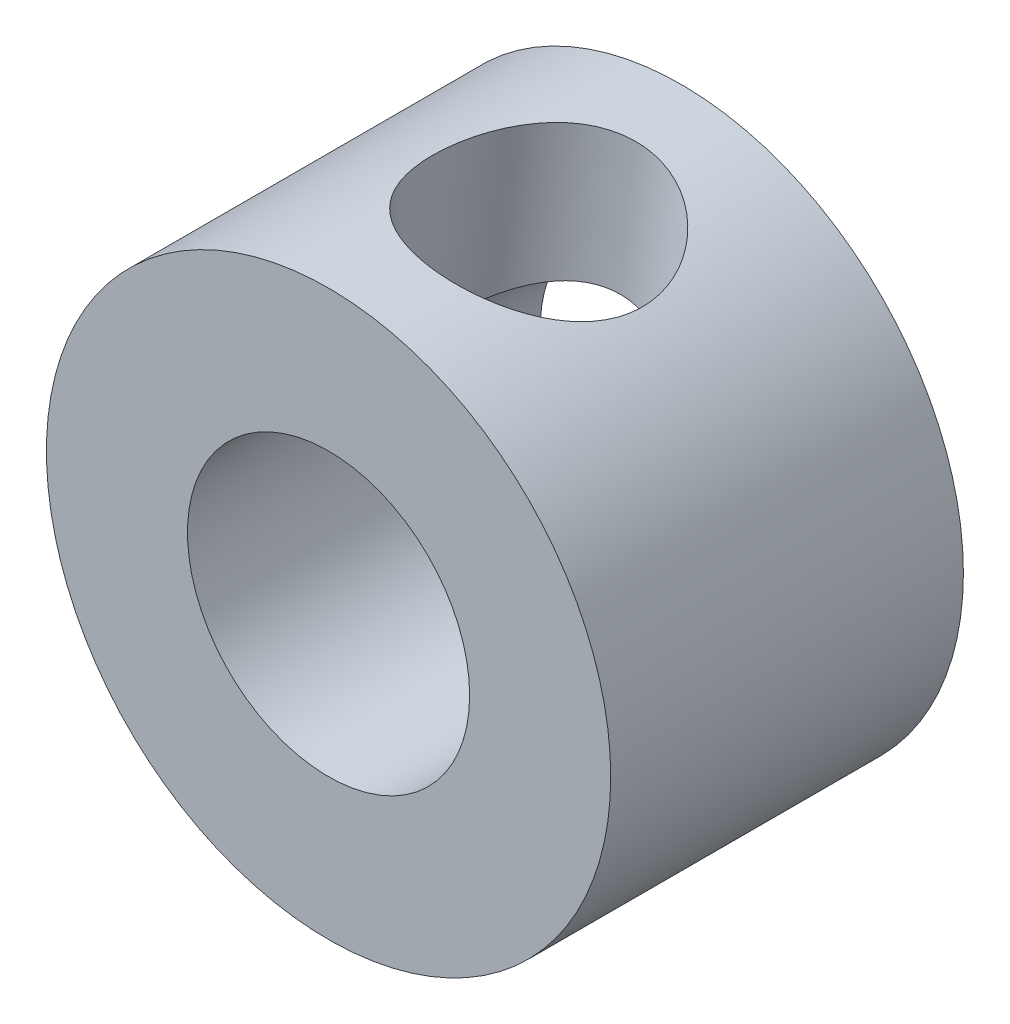
ISO-10303-21;
HEADER;
FILE_DESCRIPTION(('STEP AP214'),'2;1');
FILE_NAME('part.step','',(''),(''),'','','');
FILE_SCHEMA(('AUTOMOTIVE_DESIGN { 1 0 10303 214 1 1 1 1 }'));
ENDSEC;
DATA;
#1=APPLICATION_CONTEXT('core data for automotive mechanical design processes');
#2=APPLICATION_PROTOCOL_DEFINITION('international standard','automotive_design',2000,#1);
#3=PRODUCT_CONTEXT('',#1,'mechanical');
#4=PRODUCT('Part','Part','',(#3));
#5=PRODUCT_RELATED_PRODUCT_CATEGORY('part','',(#4));
#6=PRODUCT_DEFINITION_FORMATION('','',#4);
#7=PRODUCT_DEFINITION_CONTEXT('part definition',#1,'design');
#8=PRODUCT_DEFINITION('design','',#6,#7);
#9=PRODUCT_DEFINITION_SHAPE('','',#8);
#10=(LENGTH_UNIT() NAMED_UNIT(*) SI_UNIT(.MILLI.,.METRE.));
#11=(NAMED_UNIT(*) PLANE_ANGLE_UNIT() SI_UNIT($,.RADIAN.));
#12=(NAMED_UNIT(*) SI_UNIT($,.STERADIAN.) SOLID_ANGLE_UNIT());
#13=UNCERTAINTY_MEASURE_WITH_UNIT(LENGTH_MEASURE(1.E-05),#10,'distance_accuracy_value','');
#14=(GEOMETRIC_REPRESENTATION_CONTEXT(3) GLOBAL_UNCERTAINTY_ASSIGNED_CONTEXT((#13)) GLOBAL_UNIT_ASSIGNED_CONTEXT((#10,
#11,#12)) REPRESENTATION_CONTEXT('',''));
#15=CARTESIAN_POINT('',(0.,0.,0.));
#16=DIRECTION('',(0.,0.,1.));
#17=DIRECTION('',(1.,0.,0.));
#18=AXIS2_PLACEMENT_3D('',#15,#16,#17);
#19=CARTESIAN_POINT('',(0.,0.,5.));
#20=DIRECTION('',(0.,0.,-1.));
#21=DIRECTION('',(-1.,0.,0.));
#22=AXIS2_PLACEMENT_3D('',#19,#20,#21);
#23=CYLINDRICAL_SURFACE('',#22,4.);
#24=CARTESIAN_POINT('',(-1.02733928868957,3.86582125633284,2.5));
#25=CARTESIAN_POINT('',(-1.02734265890142,3.86581881922719,2.41899251627921));
#26=CARTESIAN_POINT('',(-1.02047273092971,3.8676652134899,2.33800507749636));
#27=CARTESIAN_POINT('',(-0.993330380940918,3.87472440822533,2.1784719170868));
#28=CARTESIAN_POINT('',(-0.973058360325385,3.87993710787487,2.09992612240499));
#29=CARTESIAN_POINT('',(-0.920043352540823,3.89284656011024,1.94762462838648));
#30=CARTESIAN_POINT('',(-0.887330247022073,3.90053735397063,1.87385794334892));
#31=CARTESIAN_POINT('',(-0.810587811596663,3.91720364104019,1.73262810318116));
#32=CARTESIAN_POINT('',(-0.766555082704462,3.92617951976729,1.66516684971748));
#33=CARTESIAN_POINT('',(-0.666225623724116,3.94447127927429,1.53510968837719));
#34=CARTESIAN_POINT('',(-0.609464559027656,3.95378419220841,1.47287147037061));
#35=CARTESIAN_POINT('',(-0.4864880266858,3.97079074456261,1.35827718532851));
#36=CARTESIAN_POINT('',(-0.420270547596204,3.97848403861505,1.30592322625815));
#37=CARTESIAN_POINT('',(-0.27765210171074,3.99101463726081,1.21086048770439));
#38=CARTESIAN_POINT('',(-0.20098128903239,3.99574585270344,1.16854052528415));
#39=CARTESIAN_POINT('',(-0.0414917882333371,4.00057872909077,1.09734882747509));
#40=CARTESIAN_POINT('',(0.041324756123118,4.00068199683108,1.06847242800803));
#41=CARTESIAN_POINT('',(0.206866213396435,3.99546799134705,1.02624210422539));
#42=CARTESIAN_POINT('',(0.289441002308203,3.99038433006285,1.01227237255955));
#43=CARTESIAN_POINT('',(0.455258661486501,3.97487915687381,0.998278799055018));
#44=CARTESIAN_POINT('',(0.538501305702838,3.96445938180064,0.998250422381297));
#45=CARTESIAN_POINT('',(0.698928723216405,3.93926018030917,1.01178176146518));
#46=CARTESIAN_POINT('',(0.776209453912666,3.92472194412767,1.02466929794882));
#47=CARTESIAN_POINT('',(0.926903635636088,3.89188894584785,1.06253591522556));
#48=CARTESIAN_POINT('',(1.00031681239976,3.87359391778997,1.08751585226205));
#49=CARTESIAN_POINT('',(1.14253869448108,3.83407574075199,1.14917045167585));
#50=CARTESIAN_POINT('',(1.2112648499092,3.81281385606815,1.18601000526841));
#51=CARTESIAN_POINT('',(1.34148554834756,3.76897125095874,1.27019209692939));
#52=CARTESIAN_POINT('',(1.40297774879397,3.74639010684228,1.31753802301761));
#53=CARTESIAN_POINT('',(1.52092399434128,3.70014008090216,1.42462728628319));
#54=CARTESIAN_POINT('',(1.57687273501997,3.67648486134498,1.48493391565043));
#55=CARTESIAN_POINT('',(1.67820536266551,3.63135110987348,1.61459299332157));
#56=CARTESIAN_POINT('',(1.72358659637367,3.60987312537567,1.68394770658664));
#57=CARTESIAN_POINT('',(1.80357654156705,3.57059492867679,1.83171946746283));
#58=CARTESIAN_POINT('',(1.83792378959015,3.55288692931804,1.91030349368607));
#59=CARTESIAN_POINT('',(1.89334712550917,3.52366713131311,2.07309622516758));
#60=CARTESIAN_POINT('',(1.91443059827223,3.5121518852494,2.15730177159369));
#61=CARTESIAN_POINT('',(1.94175867706646,3.49711375750742,2.32397596231596));
#62=CARTESIAN_POINT('',(1.94875781590315,3.49318496225103,2.40628410553614));
#63=CARTESIAN_POINT('',(1.94992934163625,3.49253178311701,2.57100935674174));
#64=CARTESIAN_POINT('',(1.94410493386362,3.49580559889858,2.65342643235247));
#65=CARTESIAN_POINT('',(1.92044816993536,3.50885218186317,2.81192992228768));
#66=CARTESIAN_POINT('',(1.90319894426611,3.51830907286495,2.88813113576466));
#67=CARTESIAN_POINT('',(1.85784220271283,3.54246776089607,3.03634794472019));
#68=CARTESIAN_POINT('',(1.82973246217915,3.55717063245602,3.10836267916813));
#69=CARTESIAN_POINT('',(1.76215624024822,3.59113945099152,3.2491644380762));
#70=CARTESIAN_POINT('',(1.72230355987914,3.61055578144953,3.31772929213734));
#71=CARTESIAN_POINT('',(1.63262589017459,3.65198154255814,3.44712898172604));
#72=CARTESIAN_POINT('',(1.58279725087144,3.67399192109369,3.50796097462463));
#73=CARTESIAN_POINT('',(1.47068350398614,3.72034836800946,3.62416837319509));
#74=CARTESIAN_POINT('',(1.40780898997722,3.74475405038438,3.67895340876875));
#75=CARTESIAN_POINT('',(1.27320802407256,3.79262929998244,3.77683836758943));
#76=CARTESIAN_POINT('',(1.20148154347427,3.81609886416987,3.81993825294583));
#77=CARTESIAN_POINT('',(1.05110686542589,3.86021832474947,3.89294605619961));
#78=CARTESIAN_POINT('',(0.97248348814519,3.88087770064718,3.9228991237926));
#79=CARTESIAN_POINT('',(0.810281854439043,3.91795219545285,3.96865641384991));
#80=CARTESIAN_POINT('',(0.726705946228717,3.93436930632356,3.98446728542239));
#81=CARTESIAN_POINT('',(0.562177933555114,3.96112324673068,4.00077440275482));
#82=CARTESIAN_POINT('',(0.48135678463265,3.97175867360409,4.00210948305898));
#83=CARTESIAN_POINT('',(0.320078244636425,3.98799646675953,3.9915848405546));
#84=CARTESIAN_POINT('',(0.2396208108665,3.99359943990992,3.97972670911414));
#85=CARTESIAN_POINT('',(0.0833974680032548,3.99987680656648,3.94374114850637));
#86=CARTESIAN_POINT('',(0.00756499017876403,4.0006681013615,3.91992009412164));
#87=CARTESIAN_POINT('',(-0.139502231962902,3.99824386008284,3.86098998661563));
#88=CARTESIAN_POINT('',(-0.210736102869378,3.99502756519122,3.82587879669524));
#89=CARTESIAN_POINT('',(-0.349765941492791,3.98531365243125,3.74368605649518));
#90=CARTESIAN_POINT('',(-0.417291518300253,3.97868378313563,3.69616335948585));
#91=CARTESIAN_POINT('',(-0.543877935032302,3.96336590741857,3.59119216981239));
#92=CARTESIAN_POINT('',(-0.602935739703128,3.95467716594465,3.53374013419212));
#93=CARTESIAN_POINT('',(-0.713971363937379,3.93618872238693,3.40693586835493));
#94=CARTESIAN_POINT('',(-0.765410997054105,3.9263545884823,3.33711559784568));
#95=CARTESIAN_POINT('',(-0.855649513374975,3.90768414164497,3.18958413042667));
#96=CARTESIAN_POINT('',(-0.894447085128546,3.89884793229615,3.11187211594651));
#97=CARTESIAN_POINT('',(-0.95928210885051,3.88341981008075,2.94704431902459));
#98=CARTESIAN_POINT('',(-0.984685589275191,3.87694327008552,2.85966563348821));
#99=CARTESIAN_POINT('',(-1.01870675451208,3.86814672928786,2.68151472804421));
#100=CARTESIAN_POINT('',(-1.02733551336977,3.86582398638472,2.59074478729001));
#101=CARTESIAN_POINT('',(-1.02733928868957,3.86582125633284,2.5));
#102=B_SPLINE_CURVE_WITH_KNOTS('',3,(#24,#25,#26,#27,#28,#29,#30,#31,#32,#33,#34,#35,#36,#37,
#38,#39,#40,#41,#42,#43,#44,#45,#46,#47,#48,#49,#50,#51,#52,#53,#54,#55,#56,#57,#58,#59,#60,#61,
#62,#63,#64,#65,#66,#67,#68,#69,#70,#71,#72,#73,#74,#75,#76,#77,#78,#79,#80,#81,#82,#83,#84,#85,
#86,#87,#88,#89,#90,#91,#92,#93,#94,#95,#96,#97,#98,#99,#100,#101),.UNSPECIFIED.,.T.,.F.,(4,2,2,
2,2,2,2,2,2,2,2,2,2,2,2,2,2,2,2,2,2,2,2,2,2,2,2,2,2,2,2,2,2,2,2,2,2,2,4),(0.,0.242684541416169,
0.485361814598853,0.727459856757027,0.96963067968293,1.22274652401127,1.47591628822982,
1.7377007213642,1.99939426381329,2.24980018489678,2.50012465404856,2.73806472803193,
2.97602165263334,3.21744131210667,3.45893893628974,3.71456675065873,3.97025867827333,
4.23162592252965,4.49284751635472,4.73965657740483,4.98640395388882,5.22143845928196,
5.45652113429524,5.70041561005819,5.94439948466353,6.20385016993621,6.46330169650175,
6.72185508890165,6.98028685560124,7.22365720549933,7.46699820319476,7.70440274003887,
7.94185223512827,8.18928323676983,8.4368027089496,8.69738599542075,8.95799630544238,
9.23003178870922,9.50188762323049),.UNSPECIFIED.);
#103=CARTESIAN_POINT('',(-1.02733928868957,3.86582125633284,2.5));
#104=VERTEX_POINT('',#103);
#105=EDGE_CURVE('E57',#104,#104,#102,.T.);
#106=ORIENTED_EDGE('',*,*,#105,.T.);
#107=EDGE_LOOP('',(#106));
#108=FACE_BOUND('',#107,.T.);
#109=CARTESIAN_POINT('',(0.,0.,5.));
#110=DIRECTION('',(0.,0.,1.));
#111=DIRECTION('',(1.,0.,0.));
#112=AXIS2_PLACEMENT_3D('',#109,#110,#111);
#113=CIRCLE('',#112,4.);
#114=CARTESIAN_POINT('',(4.,0.,5.));
#115=VERTEX_POINT('',#114);
#116=EDGE_CURVE('E10',#115,#115,#113,.T.);
#117=ORIENTED_EDGE('',*,*,#116,.F.);
#118=EDGE_LOOP('',(#117));
#119=FACE_BOUND('',#118,.T.);
#120=CARTESIAN_POINT('',(0.,0.,0.));
#121=DIRECTION('',(0.,0.,1.));
#122=DIRECTION('',(1.,0.,0.));
#123=AXIS2_PLACEMENT_3D('',#120,#121,#122);
#124=CIRCLE('',#123,4.);
#125=CARTESIAN_POINT('',(4.,0.,0.));
#126=VERTEX_POINT('',#125);
#127=EDGE_CURVE('E45',#126,#126,#124,.T.);
#128=ORIENTED_EDGE('',*,*,#127,.T.);
#129=EDGE_LOOP('',(#128));
#130=FACE_BOUND('',#129,.T.);
#131=ADVANCED_FACE('F41',(#108,#119,#130),#23,.T.);
#132=CARTESIAN_POINT('',(0.,0.,5.));
#133=DIRECTION('',(0.,0.,1.));
#134=DIRECTION('',(1.,0.,0.));
#135=AXIS2_PLACEMENT_3D('',#132,#133,#134);
#136=PLANE('',#135);
#137=CARTESIAN_POINT('',(0.,0.,5.));
#138=DIRECTION('',(0.,0.,1.));
#139=DIRECTION('',(1.,0.,0.));
#140=AXIS2_PLACEMENT_3D('',#137,#138,#139);
#141=CIRCLE('',#140,2.);
#142=CARTESIAN_POINT('',(2.,0.,5.));
#143=VERTEX_POINT('',#142);
#144=EDGE_CURVE('E54',#143,#143,#141,.T.);
#145=ORIENTED_EDGE('',*,*,#144,.F.);
#146=EDGE_LOOP('',(#145));
#147=FACE_BOUND('',#146,.T.);
#148=ORIENTED_EDGE('',*,*,#116,.T.);
#149=EDGE_LOOP('',(#148));
#150=FACE_BOUND('',#149,.T.);
#151=ADVANCED_FACE('F83',(#147,#150),#136,.T.);
#152=CARTESIAN_POINT('',(0.,0.,0.));
#153=DIRECTION('',(0.,0.,1.));
#154=DIRECTION('',(1.,0.,0.));
#155=AXIS2_PLACEMENT_3D('',#152,#153,#154);
#156=PLANE('',#155);
#157=CARTESIAN_POINT('',(0.,0.,0.));
#158=DIRECTION('',(0.,0.,1.));
#159=DIRECTION('',(1.,0.,0.));
#160=AXIS2_PLACEMENT_3D('',#157,#158,#159);
#161=CIRCLE('',#160,2.);
#162=CARTESIAN_POINT('',(2.,0.,0.));
#163=VERTEX_POINT('',#162);
#164=EDGE_CURVE('E52',#163,#163,#161,.T.);
#165=ORIENTED_EDGE('',*,*,#164,.T.);
#166=EDGE_LOOP('',(#165));
#167=FACE_BOUND('',#166,.T.);
#168=ORIENTED_EDGE('',*,*,#127,.F.);
#169=EDGE_LOOP('',(#168));
#170=FACE_BOUND('',#169,.T.);
#171=ADVANCED_FACE('F81',(#167,#170),#156,.F.);
#172=CARTESIAN_POINT('',(0.,0.,0.));
#173=DIRECTION('',(0.,0.,1.));
#174=DIRECTION('',(1.,0.,0.));
#175=AXIS2_PLACEMENT_3D('',#172,#173,#174);
#176=CYLINDRICAL_SURFACE('',#175,2.);
#177=CARTESIAN_POINT('',(-1.32389053648145,1.49910434840769,2.5));
#178=CARTESIAN_POINT('',(-1.32388076786403,1.49911949632991,2.56999742342563));
#179=CARTESIAN_POINT('',(-1.31826292106822,1.50413169269692,2.64004583431192));
#180=CARTESIAN_POINT('',(-1.29650106630722,1.52291458264065,2.77732985620948));
#181=CARTESIAN_POINT('',(-1.28032568181075,1.53671138066007,2.84455644501951));
#182=CARTESIAN_POINT('',(-1.23925695264199,1.57000773771396,2.97357984673838));
#183=CARTESIAN_POINT('',(-1.21448696764687,1.5894259901785,3.03543877676246));
#184=CARTESIAN_POINT('',(-1.15745423528105,1.63142714675296,3.15434545444519));
#185=CARTESIAN_POINT('',(-1.12519239351826,1.65400966823855,3.21139378246922));
#186=CARTESIAN_POINT('',(-1.0465244974687,1.70511574068447,3.33211279631659));
#187=CARTESIAN_POINT('',(-0.998571244902114,1.73389297497964,3.39466793422647));
#188=CARTESIAN_POINT('',(-0.893695505870861,1.79021351826624,3.51252546624227));
#189=CARTESIAN_POINT('',(-0.836759820965332,1.81775493367886,3.56781696482027));
#190=CARTESIAN_POINT('',(-0.702009559235433,1.87444925284167,3.68085873865546));
#191=CARTESIAN_POINT('',(-0.6223055497263,1.90278299994108,3.73680596671985));
#192=CARTESIAN_POINT('',(-0.452234991037284,1.95018505654564,3.83462220828283));
#193=CARTESIAN_POINT('',(-0.361894179403409,1.96927518223139,3.87652429746881));
#194=CARTESIAN_POINT('',(-0.20191090904877,1.99089298191507,3.93320768590294));
#195=CARTESIAN_POINT('',(-0.13424349308703,1.9966794097913,3.95235709597846));
#196=CARTESIAN_POINT('',(0.00327599447804024,2.00117595788536,3.98139011599674));
#197=CARTESIAN_POINT('',(0.0731261133617739,1.99989223272508,3.99128177610673));
#198=CARTESIAN_POINT('',(0.213183767107957,1.98984794504091,4.00122173386249));
#199=CARTESIAN_POINT('',(0.283391759108678,1.9810680136861,4.00124445437643));
#200=CARTESIAN_POINT('',(0.421809973789675,1.95627760449513,3.99138206321971));
#201=CARTESIAN_POINT('',(0.490019730061287,1.94026545267975,3.98149465709185));
#202=CARTESIAN_POINT('',(0.620244199206358,1.9025615141627,3.95291894941012));
#203=CARTESIAN_POINT('',(0.682391077453605,1.8810830357391,3.93454367361292));
#204=CARTESIAN_POINT('',(0.801840256618693,1.83335599986175,3.89000435781776));
#205=CARTESIAN_POINT('',(0.859141497679024,1.80710640278325,3.86383861948683));
#206=CARTESIAN_POINT('',(0.974109079600664,1.74806397930234,3.80147038485468));
#207=CARTESIAN_POINT('',(1.03114315824561,1.71487041956677,3.76448790338123));
#208=CARTESIAN_POINT('',(1.13802785012731,1.64588799914309,3.68326629602948));
#209=CARTESIAN_POINT('',(1.18787227327389,1.61009694145998,3.63902098630009));
#210=CARTESIAN_POINT('',(1.28937176288332,1.530507045061,3.53477665117905));
#211=CARTESIAN_POINT('',(1.33945413861713,1.48651797259525,3.47339078997359));
#212=CARTESIAN_POINT('',(1.42921165019028,1.40043366243195,3.34216541637805));
#213=CARTESIAN_POINT('',(1.46888182895101,1.35833933466416,3.27232190047493));
#214=CARTESIAN_POINT('',(1.53072819153295,1.2878736004653,3.13901812975436));
#215=CARTESIAN_POINT('',(1.55481131057446,1.25843269186013,3.07701295469934));
#216=CARTESIAN_POINT('',(1.59555790499423,1.20635407184053,2.94793471858061));
#217=CARTESIAN_POINT('',(1.61223815240887,1.183701020025,2.88087352030963));
#218=CARTESIAN_POINT('',(1.6349442169928,1.15206913406508,2.75631305600167));
#219=CARTESIAN_POINT('',(1.64242646948765,1.14126997683478,2.69955291788313));
#220=CARTESIAN_POINT('',(1.6517443935333,1.12774705943293,2.58464453382617));
#221=CARTESIAN_POINT('',(1.65358728938661,1.12501296766454,2.52649816009717));
#222=CARTESIAN_POINT('',(1.65151546110919,1.12805068154689,2.4105210082666));
#223=CARTESIAN_POINT('',(1.64759861773671,1.13382561801592,2.35269035419032));
#224=CARTESIAN_POINT('',(1.63425274744532,1.15297380421153,2.23892384755712));
#225=CARTESIAN_POINT('',(1.62481431182589,1.16636002233883,2.18299140205189));
#226=CARTESIAN_POINT('',(1.59636069565561,1.205155129939,2.05366195506112));
#227=CARTESIAN_POINT('',(1.57508327790503,1.23318868242475,1.98156404608496));
#228=CARTESIAN_POINT('',(1.5238389804583,1.2959773525822,1.84369233635988));
#229=CARTESIAN_POINT('',(1.49385609711407,1.33074480994668,1.77793048270525));
#230=CARTESIAN_POINT('',(1.42441718112665,1.4048875496587,1.65065099195187));
#231=CARTESIAN_POINT('',(1.38466245402912,1.44438264756449,1.58936712378174));
#232=CARTESIAN_POINT('',(1.29637611127146,1.52412408432969,1.47399790363875));
#233=CARTESIAN_POINT('',(1.2478402305349,1.5643707796895,1.41991607201106));
#234=CARTESIAN_POINT('',(1.13038081201922,1.65188043991479,1.30872300837063));
#235=CARTESIAN_POINT('',(1.05931950619863,1.69875862272571,1.2535247611424));
#236=CARTESIAN_POINT('',(0.90461098421823,1.78591887226888,1.15737926654913));
#237=CARTESIAN_POINT('',(0.820991578869995,1.82621511350139,1.11640117541871));
#238=CARTESIAN_POINT('',(0.670375474817964,1.88547649217381,1.06156200855313));
#239=CARTESIAN_POINT('',(0.606071863492535,1.90720053374706,1.04324320672456));
#240=CARTESIAN_POINT('',(0.473770412728245,1.94428498303194,1.01587120369248));
#241=CARTESIAN_POINT('',(0.405775933607374,1.95965107290369,1.0068097184515));
#242=CARTESIAN_POINT('',(0.267797218271312,1.98322848888418,0.998483609071402));
#243=CARTESIAN_POINT('',(0.197808694352123,1.9914229714856,0.999241982651762));
#244=CARTESIAN_POINT('',(0.0581463039593668,2.00037950864671,1.01056099130125));
#245=CARTESIAN_POINT('',(-0.0115274737199865,2.00113958257407,1.02112423770749));
#246=CARTESIAN_POINT('',(-0.146531916718304,1.99573679736857,1.05097491616725));
#247=CARTESIAN_POINT('',(-0.21192994570153,1.98977427169687,1.07000018132156));
#248=CARTESIAN_POINT('',(-0.33910558848119,1.97208890644361,1.11578806561895));
#249=CARTESIAN_POINT('',(-0.400882424444689,1.96036483431885,1.14255233983093));
#250=CARTESIAN_POINT('',(-0.526601536003217,1.93062751666189,1.20627793759598));
#251=CARTESIAN_POINT('',(-0.589996378056317,1.9120522835048,1.2440509313596));
#252=CARTESIAN_POINT('',(-0.710346765384005,1.87068584160814,1.32686644055423));
#253=CARTESIAN_POINT('',(-0.76729630979927,1.84789075519179,1.37191563728607));
#254=CARTESIAN_POINT('',(-0.884819505531256,1.79499899799721,1.47800536656081));
#255=CARTESIAN_POINT('',(-0.943881416599835,1.76434996850823,1.54044639943992));
#256=CARTESIAN_POINT('',(-1.051231104012,1.70256883987705,1.6738680718999));
#257=CARTESIAN_POINT('',(-1.09951493239106,1.67143656817667,1.74485182603659));
#258=CARTESIAN_POINT('',(-1.17477236257018,1.61911622853197,1.87888325059033));
#259=CARTESIAN_POINT('',(-1.20409620924793,1.59723246001833,1.94033498270658));
#260=CARTESIAN_POINT('',(-1.25403919337819,1.55832934742232,2.0680829130559));
#261=CARTESIAN_POINT('',(-1.2746814408288,1.54129712830741,2.13436569159547));
#262=CARTESIAN_POINT('',(-1.30122552221887,1.51888852287391,2.25078821959695));
#263=CARTESIAN_POINT('',(-1.30967423866619,1.51155914000635,2.29996707129048));
#264=CARTESIAN_POINT('',(-1.32100843052975,1.50166317254513,2.39942233303366));
#265=CARTESIAN_POINT('',(-1.32389755646819,1.49909346271031,2.44969800094373));
#266=CARTESIAN_POINT('',(-1.32389053648145,1.49910434840769,2.5));
#267=B_SPLINE_CURVE_WITH_KNOTS('',3,(#177,#178,#179,#180,#181,#182,#183,#184,#185,#186,#187,
#188,#189,#190,#191,#192,#193,#194,#195,#196,#197,#198,#199,#200,#201,#202,#203,#204,#205,#206,
#207,#208,#209,#210,#211,#212,#213,#214,#215,#216,#217,#218,#219,#220,#221,#222,#223,#224,#225,
#226,#227,#228,#229,#230,#231,#232,#233,#234,#235,#236,#237,#238,#239,#240,#241,#242,#243,#244,
#245,#246,#247,#248,#249,#250,#251,#252,#253,#254,#255,#256,#257,#258,#259,#260,#261,#262,#263,
#264,#265,#266),.UNSPECIFIED.,.T.,.F.,(4,2,2,2,2,2,2,2,2,2,2,2,2,2,2,2,2,2,2,2,2,2,2,2,2,2,2,2,
2,2,2,2,2,2,2,2,2,2,2,2,2,2,2,2,4),(0.,0.20973177668449,0.420089722582993,0.627545385620137,
0.834975984672343,1.08585208691168,1.33710031031849,1.63964848103537,1.94147907444962,
2.15227725277554,2.3628919587071,2.57405250727806,2.78526195641287,2.98923755895049,
3.19325766108668,3.41936844116894,3.64567274887662,3.916495172047,4.18744629647932,
4.40499409477195,4.62204646613004,4.79608005545899,4.96989060538191,5.14376512326211,
5.31793678696017,5.55730028202396,5.79710662639149,6.04543209090059,6.29387849446617,
6.59652499511462,6.89851088586563,7.10852896194425,7.31835893539179,7.52868041101041,
7.73905791773942,7.9433281269191,8.1476420537933,8.37510052489608,8.60276905744642,
8.87547580578153,9.14828228208529,9.36218279640833,9.57551025772696,9.72632812073762,
9.87704692032404),.UNSPECIFIED.);
#268=CARTESIAN_POINT('',(-1.32389053648145,1.49910434840769,2.5));
#269=VERTEX_POINT('',#268);
#270=EDGE_CURVE('E66',#269,#269,#267,.T.);
#271=ORIENTED_EDGE('',*,*,#270,.T.);
#272=EDGE_LOOP('',(#271));
#273=FACE_BOUND('',#272,.T.);
#274=ORIENTED_EDGE('',*,*,#164,.F.);
#275=EDGE_LOOP('',(#274));
#276=FACE_BOUND('',#275,.T.);
#277=ORIENTED_EDGE('',*,*,#144,.T.);
#278=EDGE_LOOP('',(#277));
#279=FACE_BOUND('',#278,.T.);
#280=ADVANCED_FACE('F74',(#273,#276,#279),#176,.F.);
#281=CARTESIAN_POINT('',(0.497313961310615,3.96896445233332,2.5));
#282=DIRECTION('',(0.124328490327654,0.99224111308333,0.));
#283=DIRECTION('',(-0.99224111308333,0.124328490327654,0.));
#284=AXIS2_PLACEMENT_3D('',#281,#282,#283);
#285=CYLINDRICAL_SURFACE('',#284,1.49999999999999);
#286=ORIENTED_EDGE('',*,*,#270,.F.);
#287=EDGE_LOOP('',(#286));
#288=FACE_BOUND('',#287,.T.);
#289=ORIENTED_EDGE('',*,*,#105,.F.);
#290=EDGE_LOOP('',(#289));
#291=FACE_BOUND('',#290,.T.);
#292=ADVANCED_FACE('F71',(#288,#291),#285,.F.);
#293=CLOSED_SHELL('',(#131,#151,#171,#280,#292));
#294=MANIFOLD_SOLID_BREP('B2',#293);
#295=ADVANCED_BREP_SHAPE_REPRESENTATION('',(#18,#294),#14);
#296=SHAPE_DEFINITION_REPRESENTATION(#9,#295);
ENDSEC;
END-ISO-10303-21;
